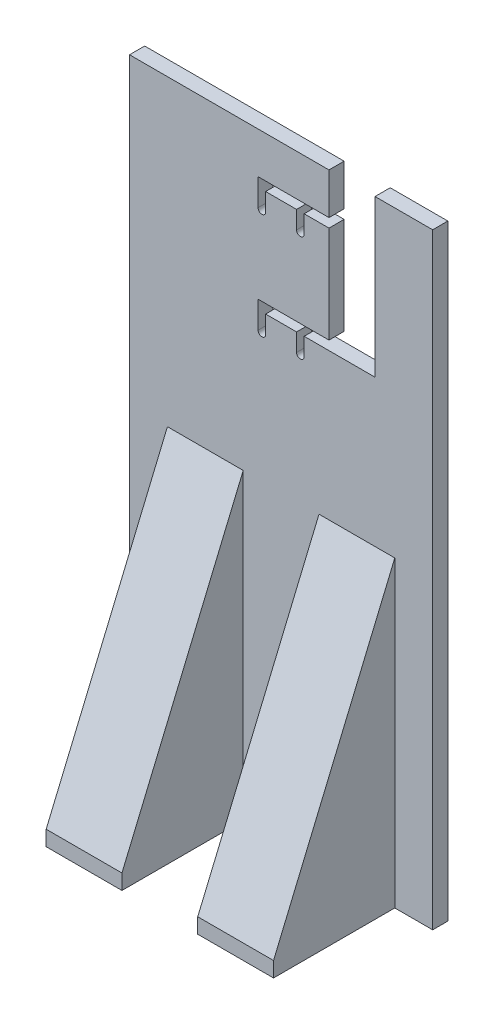
ISO-10303-21;
HEADER;
FILE_DESCRIPTION(('STEP AP214'),'2;1');
FILE_NAME('part.step','',(''),(''),'','','');
FILE_SCHEMA(('AUTOMOTIVE_DESIGN { 1 0 10303 214 1 1 1 1 }'));
ENDSEC;
DATA;
#1=APPLICATION_CONTEXT('core data for automotive mechanical design processes');
#2=APPLICATION_PROTOCOL_DEFINITION('international standard','automotive_design',2000,#1);
#3=PRODUCT_CONTEXT('',#1,'mechanical');
#4=PRODUCT('Part','Part','',(#3));
#5=PRODUCT_RELATED_PRODUCT_CATEGORY('part','',(#4));
#6=PRODUCT_DEFINITION_FORMATION('','',#4);
#7=PRODUCT_DEFINITION_CONTEXT('part definition',#1,'design');
#8=PRODUCT_DEFINITION('design','',#6,#7);
#9=PRODUCT_DEFINITION_SHAPE('','',#8);
#10=(LENGTH_UNIT() NAMED_UNIT(*) SI_UNIT(.MILLI.,.METRE.));
#11=(NAMED_UNIT(*) PLANE_ANGLE_UNIT() SI_UNIT($,.RADIAN.));
#12=(NAMED_UNIT(*) SI_UNIT($,.STERADIAN.) SOLID_ANGLE_UNIT());
#13=UNCERTAINTY_MEASURE_WITH_UNIT(LENGTH_MEASURE(1.E-05),#10,'distance_accuracy_value','');
#14=(GEOMETRIC_REPRESENTATION_CONTEXT(3) GLOBAL_UNCERTAINTY_ASSIGNED_CONTEXT((#13)) GLOBAL_UNIT_ASSIGNED_CONTEXT((#10,
#11,#12)) REPRESENTATION_CONTEXT('',''));
#15=CARTESIAN_POINT('',(0.,0.,0.));
#16=DIRECTION('',(0.,0.,1.));
#17=DIRECTION('',(1.,0.,0.));
#18=AXIS2_PLACEMENT_3D('',#15,#16,#17);
#19=CARTESIAN_POINT('',(15.,1.,14.));
#20=DIRECTION('',(0.,0.388057000058133,0.921635375138065));
#21=DIRECTION('',(0.,0.921635375138065,-0.388057000058133));
#22=AXIS2_PLACEMENT_3D('',#19,#20,#21);
#23=PLANE('',#22);
#24=DIRECTION('',(1.,0.,0.));
#25=VECTOR('',#24,1.);
#26=CARTESIAN_POINT('',(0.,20.,6.));
#27=LINE('',#26,#25);
#28=CARTESIAN_POINT('',(12.5,20.,6.));
#29=VERTEX_POINT('',#28);
#30=CARTESIAN_POINT('',(17.5,20.,6.));
#31=VERTEX_POINT('',#30);
#32=EDGE_CURVE('E302',#29,#31,#27,.T.);
#33=ORIENTED_EDGE('',*,*,#32,.F.);
#34=DIRECTION('',(0.,0.921635375138065,-0.388057000058133));
#35=VECTOR('',#34,1.);
#36=CARTESIAN_POINT('',(12.5,1.,14.));
#37=LINE('',#36,#35);
#38=CARTESIAN_POINT('',(12.5,1.,14.));
#39=VERTEX_POINT('',#38);
#40=EDGE_CURVE('E298',#39,#29,#37,.T.);
#41=ORIENTED_EDGE('',*,*,#40,.F.);
#42=DIRECTION('',(-1.,0.,0.));
#43=VECTOR('',#42,1.);
#44=CARTESIAN_POINT('',(17.5,1.,14.));
#45=LINE('',#44,#43);
#46=CARTESIAN_POINT('',(17.5,1.,14.));
#47=VERTEX_POINT('',#46);
#48=EDGE_CURVE('E310',#47,#39,#45,.T.);
#49=ORIENTED_EDGE('',*,*,#48,.F.);
#50=DIRECTION('',(0.,0.921635375138065,-0.388057000058133));
#51=VECTOR('',#50,1.);
#52=CARTESIAN_POINT('',(17.5,1.,14.));
#53=LINE('',#52,#51);
#54=EDGE_CURVE('E293',#47,#31,#53,.T.);
#55=ORIENTED_EDGE('',*,*,#54,.T.);
#56=EDGE_LOOP('',(#33,#41,#49,#55));
#57=FACE_BOUND('',#56,.T.);
#58=ADVANCED_FACE('F45',(#57),#23,.T.);
#59=CARTESIAN_POINT('',(5.,1.,14.));
#60=DIRECTION('',(0.,-0.388057000058133,-0.921635375138065));
#61=DIRECTION('',(0.,0.921635375138065,-0.388057000058133));
#62=AXIS2_PLACEMENT_3D('',#59,#60,#61);
#63=PLANE('',#62);
#64=DIRECTION('',(-1.,0.,0.));
#65=VECTOR('',#64,1.);
#66=CARTESIAN_POINT('',(0.,20.,6.));
#67=LINE('',#66,#65);
#68=CARTESIAN_POINT('',(2.5,20.,6.));
#69=VERTEX_POINT('',#68);
#70=CARTESIAN_POINT('',(7.5,20.,6.));
#71=VERTEX_POINT('',#70);
#72=EDGE_CURVE('E344',#69,#71,#67,.F.);
#73=ORIENTED_EDGE('',*,*,#72,.F.);
#74=DIRECTION('',(0.,0.921635375138065,-0.388057000058133));
#75=VECTOR('',#74,1.);
#76=CARTESIAN_POINT('',(2.5,1.,14.));
#77=LINE('',#76,#75);
#78=CARTESIAN_POINT('',(2.5,1.,14.));
#79=VERTEX_POINT('',#78);
#80=EDGE_CURVE('E330',#79,#69,#77,.T.);
#81=ORIENTED_EDGE('',*,*,#80,.F.);
#82=DIRECTION('',(1.,0.,0.));
#83=VECTOR('',#82,1.);
#84=CARTESIAN_POINT('',(2.5,1.,14.));
#85=LINE('',#84,#83);
#86=CARTESIAN_POINT('',(7.5,1.,14.));
#87=VERTEX_POINT('',#86);
#88=EDGE_CURVE('E352',#79,#87,#85,.T.);
#89=ORIENTED_EDGE('',*,*,#88,.T.);
#90=DIRECTION('',(0.,0.921635375138065,-0.388057000058133));
#91=VECTOR('',#90,1.);
#92=CARTESIAN_POINT('',(7.5,1.,14.));
#93=LINE('',#92,#91);
#94=EDGE_CURVE('E340',#87,#71,#93,.T.);
#95=ORIENTED_EDGE('',*,*,#94,.T.);
#96=EDGE_LOOP('',(#73,#81,#89,#95));
#97=FACE_BOUND('',#96,.T.);
#98=ADVANCED_FACE('F475',(#97),#63,.F.);
#99=CARTESIAN_POINT('',(2.5,1.,6.));
#100=DIRECTION('',(1.,0.,0.));
#101=DIRECTION('',(0.,0.,-1.));
#102=AXIS2_PLACEMENT_3D('',#99,#100,#101);
#103=PLANE('',#102);
#104=DIRECTION('',(0.,0.,1.));
#105=VECTOR('',#104,1.);
#106=CARTESIAN_POINT('',(2.5,0.,6.));
#107=LINE('',#106,#105);
#108=CARTESIAN_POINT('',(2.5,0.,6.));
#109=VERTEX_POINT('',#108);
#110=CARTESIAN_POINT('',(2.5,0.,14.));
#111=VERTEX_POINT('',#110);
#112=EDGE_CURVE('E351',#109,#111,#107,.T.);
#113=ORIENTED_EDGE('',*,*,#112,.T.);
#114=DIRECTION('',(0.,-1.,0.));
#115=VECTOR('',#114,1.);
#116=CARTESIAN_POINT('',(2.5,1.,14.));
#117=LINE('',#116,#115);
#118=EDGE_CURVE('E366',#79,#111,#117,.T.);
#119=ORIENTED_EDGE('',*,*,#118,.F.);
#120=ORIENTED_EDGE('',*,*,#80,.T.);
#121=DIRECTION('',(0.,-1.,0.));
#122=VECTOR('',#121,1.);
#123=CARTESIAN_POINT('',(2.5,1.,6.));
#124=LINE('',#123,#122);
#125=EDGE_CURVE('E356',#69,#109,#124,.T.);
#126=ORIENTED_EDGE('',*,*,#125,.T.);
#127=EDGE_LOOP('',(#113,#119,#120,#126));
#128=FACE_BOUND('',#127,.T.);
#129=ADVANCED_FACE('F471',(#128),#103,.F.);
#130=CARTESIAN_POINT('',(2.5,1.,14.));
#131=DIRECTION('',(0.,0.,-1.));
#132=DIRECTION('',(-1.,0.,0.));
#133=AXIS2_PLACEMENT_3D('',#130,#131,#132);
#134=PLANE('',#133);
#135=DIRECTION('',(1.,0.,0.));
#136=VECTOR('',#135,1.);
#137=CARTESIAN_POINT('',(2.5,0.,14.));
#138=LINE('',#137,#136);
#139=CARTESIAN_POINT('',(7.5,0.,14.));
#140=VERTEX_POINT('',#139);
#141=EDGE_CURVE('E357',#111,#140,#138,.T.);
#142=ORIENTED_EDGE('',*,*,#141,.T.);
#143=DIRECTION('',(0.,-1.,0.));
#144=VECTOR('',#143,1.);
#145=CARTESIAN_POINT('',(7.5,1.,14.));
#146=LINE('',#145,#144);
#147=EDGE_CURVE('E371',#87,#140,#146,.T.);
#148=ORIENTED_EDGE('',*,*,#147,.F.);
#149=ORIENTED_EDGE('',*,*,#88,.F.);
#150=ORIENTED_EDGE('',*,*,#118,.T.);
#151=EDGE_LOOP('',(#142,#148,#149,#150));
#152=FACE_BOUND('',#151,.T.);
#153=ADVANCED_FACE('F474',(#152),#134,.F.);
#154=CARTESIAN_POINT('',(7.5,1.,6.));
#155=DIRECTION('',(-1.,0.,0.));
#156=DIRECTION('',(0.,0.,1.));
#157=AXIS2_PLACEMENT_3D('',#154,#155,#156);
#158=PLANE('',#157);
#159=DIRECTION('',(0.,-1.,0.));
#160=VECTOR('',#159,1.);
#161=CARTESIAN_POINT('',(7.5,1.,6.));
#162=LINE('',#161,#160);
#163=CARTESIAN_POINT('',(7.5,0.,6.));
#164=VERTEX_POINT('',#163);
#165=EDGE_CURVE('E375',#71,#164,#162,.T.);
#166=ORIENTED_EDGE('',*,*,#165,.F.);
#167=ORIENTED_EDGE('',*,*,#94,.F.);
#168=ORIENTED_EDGE('',*,*,#147,.T.);
#169=DIRECTION('',(0.,0.,-1.));
#170=VECTOR('',#169,1.);
#171=CARTESIAN_POINT('',(7.5,0.,6.));
#172=LINE('',#171,#170);
#173=EDGE_CURVE('E361',#140,#164,#172,.T.);
#174=ORIENTED_EDGE('',*,*,#173,.T.);
#175=EDGE_LOOP('',(#166,#167,#168,#174));
#176=FACE_BOUND('',#175,.T.);
#177=ADVANCED_FACE('F477',(#176),#158,.F.);
#178=CARTESIAN_POINT('',(12.5,1.,6.));
#179=DIRECTION('',(-1.,0.,0.));
#180=DIRECTION('',(0.,0.,1.));
#181=AXIS2_PLACEMENT_3D('',#178,#179,#180);
#182=PLANE('',#181);
#183=ORIENTED_EDGE('',*,*,#40,.T.);
#184=DIRECTION('',(0.,-1.,0.));
#185=VECTOR('',#184,1.);
#186=CARTESIAN_POINT('',(12.5,1.,6.));
#187=LINE('',#186,#185);
#188=CARTESIAN_POINT('',(12.5,0.,6.));
#189=VERTEX_POINT('',#188);
#190=EDGE_CURVE('E331',#29,#189,#187,.T.);
#191=ORIENTED_EDGE('',*,*,#190,.T.);
#192=DIRECTION('',(0.,0.,-1.));
#193=VECTOR('',#192,1.);
#194=CARTESIAN_POINT('',(12.5,0.,6.));
#195=LINE('',#194,#193);
#196=CARTESIAN_POINT('',(12.5,0.,14.));
#197=VERTEX_POINT('',#196);
#198=EDGE_CURVE('E315',#197,#189,#195,.T.);
#199=ORIENTED_EDGE('',*,*,#198,.F.);
#200=DIRECTION('',(0.,-1.,0.));
#201=VECTOR('',#200,1.);
#202=CARTESIAN_POINT('',(12.5,1.,14.));
#203=LINE('',#202,#201);
#204=EDGE_CURVE('E335',#39,#197,#203,.T.);
#205=ORIENTED_EDGE('',*,*,#204,.F.);
#206=EDGE_LOOP('',(#183,#191,#199,#205));
#207=FACE_BOUND('',#206,.T.);
#208=ADVANCED_FACE('F437',(#207),#182,.T.);
#209=CARTESIAN_POINT('',(17.5,1.,14.));
#210=DIRECTION('',(0.,0.,1.));
#211=DIRECTION('',(1.,0.,0.));
#212=AXIS2_PLACEMENT_3D('',#209,#210,#211);
#213=PLANE('',#212);
#214=DIRECTION('',(-1.,0.,0.));
#215=VECTOR('',#214,1.);
#216=CARTESIAN_POINT('',(17.5,0.,14.));
#217=LINE('',#216,#215);
#218=CARTESIAN_POINT('',(17.5,0.,14.));
#219=VERTEX_POINT('',#218);
#220=EDGE_CURVE('E319',#219,#197,#217,.T.);
#221=ORIENTED_EDGE('',*,*,#220,.F.);
#222=DIRECTION('',(0.,-1.,0.));
#223=VECTOR('',#222,1.);
#224=CARTESIAN_POINT('',(17.5,1.,14.));
#225=LINE('',#224,#223);
#226=EDGE_CURVE('E314',#47,#219,#225,.T.);
#227=ORIENTED_EDGE('',*,*,#226,.F.);
#228=ORIENTED_EDGE('',*,*,#48,.T.);
#229=ORIENTED_EDGE('',*,*,#204,.T.);
#230=EDGE_LOOP('',(#221,#227,#228,#229));
#231=FACE_BOUND('',#230,.T.);
#232=ADVANCED_FACE('F442',(#231),#213,.T.);
#233=CARTESIAN_POINT('',(17.5,1.,6.));
#234=DIRECTION('',(1.,0.,0.));
#235=DIRECTION('',(0.,0.,-1.));
#236=AXIS2_PLACEMENT_3D('',#233,#234,#235);
#237=PLANE('',#236);
#238=DIRECTION('',(0.,0.,1.));
#239=VECTOR('',#238,1.);
#240=CARTESIAN_POINT('',(17.5,0.,6.));
#241=LINE('',#240,#239);
#242=CARTESIAN_POINT('',(17.5,0.,6.));
#243=VERTEX_POINT('',#242);
#244=EDGE_CURVE('E309',#243,#219,#241,.T.);
#245=ORIENTED_EDGE('',*,*,#244,.F.);
#246=DIRECTION('',(0.,-1.,0.));
#247=VECTOR('',#246,1.);
#248=CARTESIAN_POINT('',(17.5,1.,6.));
#249=LINE('',#248,#247);
#250=EDGE_CURVE('E326',#31,#243,#249,.T.);
#251=ORIENTED_EDGE('',*,*,#250,.F.);
#252=ORIENTED_EDGE('',*,*,#54,.F.);
#253=ORIENTED_EDGE('',*,*,#226,.T.);
#254=EDGE_LOOP('',(#245,#251,#252,#253));
#255=FACE_BOUND('',#254,.T.);
#256=ADVANCED_FACE('F446',(#255),#237,.T.);
#257=CARTESIAN_POINT('',(0.,0.,6.));
#258=DIRECTION('',(1.,0.,0.));
#259=DIRECTION('',(0.,0.,-1.));
#260=AXIS2_PLACEMENT_3D('',#257,#258,#259);
#261=PLANE('',#260);
#262=DIRECTION('',(0.,0.,-1.));
#263=VECTOR('',#262,1.);
#264=CARTESIAN_POINT('',(0.,40.,6.));
#265=LINE('',#264,#263);
#266=CARTESIAN_POINT('',(0.,40.,6.));
#267=VERTEX_POINT('',#266);
#268=CARTESIAN_POINT('',(0.,40.,5.));
#269=VERTEX_POINT('',#268);
#270=EDGE_CURVE('E397',#267,#269,#265,.T.);
#271=ORIENTED_EDGE('',*,*,#270,.T.);
#272=DIRECTION('',(0.,-1.,0.));
#273=VECTOR('',#272,1.);
#274=CARTESIAN_POINT('',(0.,0.,5.));
#275=LINE('',#274,#273);
#276=CARTESIAN_POINT('',(0.,0.,5.));
#277=VERTEX_POINT('',#276);
#278=EDGE_CURVE('E11',#269,#277,#275,.T.);
#279=ORIENTED_EDGE('',*,*,#278,.T.);
#280=DIRECTION('',(0.,0.,-1.));
#281=VECTOR('',#280,1.);
#282=CARTESIAN_POINT('',(0.,0.,6.));
#283=LINE('',#282,#281);
#284=CARTESIAN_POINT('',(0.,0.,6.));
#285=VERTEX_POINT('',#284);
#286=EDGE_CURVE('E408',#285,#277,#283,.T.);
#287=ORIENTED_EDGE('',*,*,#286,.F.);
#288=DIRECTION('',(0.,-1.,0.));
#289=VECTOR('',#288,1.);
#290=CARTESIAN_POINT('',(0.,0.,6.));
#291=LINE('',#290,#289);
#292=EDGE_CURVE('E370',#267,#285,#291,.T.);
#293=ORIENTED_EDGE('',*,*,#292,.F.);
#294=EDGE_LOOP('',(#271,#279,#287,#293));
#295=FACE_BOUND('',#294,.T.);
#296=ADVANCED_FACE('F47',(#295),#261,.F.);
#297=CARTESIAN_POINT('',(0.,40.,6.));
#298=DIRECTION('',(0.,-1.,0.));
#299=DIRECTION('',(0.,0.,-1.));
#300=AXIS2_PLACEMENT_3D('',#297,#298,#299);
#301=PLANE('',#300);
#302=DIRECTION('',(-1.,0.,0.));
#303=VECTOR('',#302,1.);
#304=CARTESIAN_POINT('',(12.8029216991025,40.,5.));
#305=LINE('',#304,#303);
#306=CARTESIAN_POINT('',(13.1579216991025,40.,5.));
#307=VERTEX_POINT('',#306);
#308=EDGE_CURVE('E61',#307,#269,#305,.T.);
#309=ORIENTED_EDGE('',*,*,#308,.T.);
#310=ORIENTED_EDGE('',*,*,#270,.F.);
#311=DIRECTION('',(-1.,0.,0.));
#312=VECTOR('',#311,1.);
#313=CARTESIAN_POINT('',(0.,40.,6.));
#314=LINE('',#313,#312);
#315=CARTESIAN_POINT('',(13.1579216991025,40.,6.));
#316=VERTEX_POINT('',#315);
#317=EDGE_CURVE('E281',#316,#267,#314,.T.);
#318=ORIENTED_EDGE('',*,*,#317,.F.);
#319=DIRECTION('',(0.,0.,-1.));
#320=VECTOR('',#319,1.);
#321=CARTESIAN_POINT('',(13.1579216991025,40.,14.));
#322=LINE('',#321,#320);
#323=EDGE_CURVE('E269',#316,#307,#322,.T.);
#324=ORIENTED_EDGE('',*,*,#323,.T.);
#325=EDGE_LOOP('',(#309,#310,#318,#324));
#326=FACE_BOUND('',#325,.T.);
#327=ADVANCED_FACE('F280',(#326),#301,.F.);
#328=CARTESIAN_POINT('',(13.1579216991025,40.,14.));
#329=DIRECTION('',(1.,0.,0.));
#330=DIRECTION('',(0.,0.,-1.));
#331=AXIS2_PLACEMENT_3D('',#328,#329,#330);
#332=PLANE('',#331);
#333=DIRECTION('',(0.,-1.,0.));
#334=VECTOR('',#333,1.);
#335=CARTESIAN_POINT('',(13.1579216991025,0.,6.));
#336=LINE('',#335,#334);
#337=CARTESIAN_POINT('',(13.1579216991025,37.275,6.));
#338=VERTEX_POINT('',#337);
#339=EDGE_CURVE('E288',#316,#338,#336,.T.);
#340=ORIENTED_EDGE('',*,*,#339,.T.);
#341=DIRECTION('',(0.,0.,-1.));
#342=VECTOR('',#341,1.);
#343=CARTESIAN_POINT('',(13.1579216991025,37.275,14.));
#344=LINE('',#343,#342);
#345=CARTESIAN_POINT('',(13.1579216991025,37.275,5.));
#346=VERTEX_POINT('',#345);
#347=EDGE_CURVE('E272',#338,#346,#344,.T.);
#348=ORIENTED_EDGE('',*,*,#347,.T.);
#349=DIRECTION('',(0.,-1.,0.));
#350=VECTOR('',#349,1.);
#351=CARTESIAN_POINT('',(13.1579216991025,40.,5.));
#352=LINE('',#351,#350);
#353=EDGE_CURVE('E267',#307,#346,#352,.T.);
#354=ORIENTED_EDGE('',*,*,#353,.F.);
#355=ORIENTED_EDGE('',*,*,#323,.F.);
#356=EDGE_LOOP('',(#340,#348,#354,#355));
#357=FACE_BOUND('',#356,.T.);
#358=ADVANCED_FACE('F268',(#357),#332,.T.);
#359=CARTESIAN_POINT('',(13.1579216991025,37.275,14.));
#360=DIRECTION('',(0.,-1.,0.));
#361=DIRECTION('',(0.,0.,-1.));
#362=AXIS2_PLACEMENT_3D('',#359,#360,#361);
#363=PLANE('',#362);
#364=DIRECTION('',(-1.,0.,0.));
#365=VECTOR('',#364,1.);
#366=CARTESIAN_POINT('',(0.,37.275,6.));
#367=LINE('',#366,#365);
#368=CARTESIAN_POINT('',(8.48,37.275,6.));
#369=VERTEX_POINT('',#368);
#370=EDGE_CURVE('E294',#338,#369,#367,.T.);
#371=ORIENTED_EDGE('',*,*,#370,.T.);
#372=DIRECTION('',(0.,0.,-1.));
#373=VECTOR('',#372,1.);
#374=CARTESIAN_POINT('',(8.48,37.275,14.));
#375=LINE('',#374,#373);
#376=CARTESIAN_POINT('',(8.48,37.275,5.));
#377=VERTEX_POINT('',#376);
#378=EDGE_CURVE('E504',#369,#377,#375,.T.);
#379=ORIENTED_EDGE('',*,*,#378,.T.);
#380=DIRECTION('',(-1.,0.,0.));
#381=VECTOR('',#380,1.);
#382=CARTESIAN_POINT('',(13.1579216991025,37.275,5.));
#383=LINE('',#382,#381);
#384=EDGE_CURVE('E277',#346,#377,#383,.T.);
#385=ORIENTED_EDGE('',*,*,#384,.F.);
#386=ORIENTED_EDGE('',*,*,#347,.F.);
#387=EDGE_LOOP('',(#371,#379,#385,#386));
#388=FACE_BOUND('',#387,.T.);
#389=ADVANCED_FACE('F501',(#388),#363,.T.);
#390=CARTESIAN_POINT('',(8.48,37.275,14.));
#391=DIRECTION('',(1.,0.,0.));
#392=DIRECTION('',(0.,0.,-1.));
#393=AXIS2_PLACEMENT_3D('',#390,#391,#392);
#394=PLANE('',#393);
#395=DIRECTION('',(0.,-1.,0.));
#396=VECTOR('',#395,1.);
#397=CARTESIAN_POINT('',(8.48,0.,6.));
#398=LINE('',#397,#396);
#399=CARTESIAN_POINT('',(8.48,35.5,6.));
#400=VERTEX_POINT('',#399);
#401=EDGE_CURVE('E564',#369,#400,#398,.T.);
#402=ORIENTED_EDGE('',*,*,#401,.T.);
#403=DIRECTION('',(0.,0.,-1.));
#404=VECTOR('',#403,1.);
#405=CARTESIAN_POINT('',(8.48,35.5,14.));
#406=LINE('',#405,#404);
#407=CARTESIAN_POINT('',(8.48,35.5,5.));
#408=VERTEX_POINT('',#407);
#409=EDGE_CURVE('E507',#400,#408,#406,.T.);
#410=ORIENTED_EDGE('',*,*,#409,.T.);
#411=DIRECTION('',(0.,-1.,0.));
#412=VECTOR('',#411,1.);
#413=CARTESIAN_POINT('',(8.48,37.275,5.));
#414=LINE('',#413,#412);
#415=EDGE_CURVE('E715',#377,#408,#414,.T.);
#416=ORIENTED_EDGE('',*,*,#415,.F.);
#417=ORIENTED_EDGE('',*,*,#378,.F.);
#418=EDGE_LOOP('',(#402,#410,#416,#417));
#419=FACE_BOUND('',#418,.T.);
#420=ADVANCED_FACE('F569',(#419),#394,.T.);
#421=CARTESIAN_POINT('',(8.73,35.5,14.));
#422=DIRECTION('',(0.,0.,-1.));
#423=DIRECTION('',(-1.,0.,0.));
#424=AXIS2_PLACEMENT_3D('',#421,#422,#423);
#425=CYLINDRICAL_SURFACE('',#424,0.25);
#426=CARTESIAN_POINT('',(8.73,35.5,6.));
#427=DIRECTION('',(0.,0.,-1.));
#428=DIRECTION('',(-1.,0.,0.));
#429=AXIS2_PLACEMENT_3D('',#426,#427,#428);
#430=CIRCLE('',#429,0.25);
#431=CARTESIAN_POINT('',(8.98,35.5,6.));
#432=VERTEX_POINT('',#431);
#433=EDGE_CURVE('E561',#400,#432,#430,.F.);
#434=ORIENTED_EDGE('',*,*,#433,.T.);
#435=DIRECTION('',(0.,0.,-1.));
#436=VECTOR('',#435,1.);
#437=CARTESIAN_POINT('',(8.98,35.5,14.));
#438=LINE('',#437,#436);
#439=CARTESIAN_POINT('',(8.98,35.5,5.));
#440=VERTEX_POINT('',#439);
#441=EDGE_CURVE('E580',#432,#440,#438,.T.);
#442=ORIENTED_EDGE('',*,*,#441,.T.);
#443=CARTESIAN_POINT('',(8.73,35.5,5.));
#444=DIRECTION('',(0.,0.,1.));
#445=DIRECTION('',(1.,0.,0.));
#446=AXIS2_PLACEMENT_3D('',#443,#444,#445);
#447=CIRCLE('',#446,0.25);
#448=EDGE_CURVE('E577',#408,#440,#447,.T.);
#449=ORIENTED_EDGE('',*,*,#448,.F.);
#450=ORIENTED_EDGE('',*,*,#409,.F.);
#451=EDGE_LOOP('',(#434,#442,#449,#450));
#452=FACE_BOUND('',#451,.T.);
#453=ADVANCED_FACE('F574',(#452),#425,.F.);
#454=CARTESIAN_POINT('',(8.98,35.5,14.));
#455=DIRECTION('',(-1.,0.,0.));
#456=DIRECTION('',(0.,0.,1.));
#457=AXIS2_PLACEMENT_3D('',#454,#455,#456);
#458=PLANE('',#457);
#459=DIRECTION('',(0.,1.,0.));
#460=VECTOR('',#459,1.);
#461=CARTESIAN_POINT('',(8.98,0.,6.));
#462=LINE('',#461,#460);
#463=CARTESIAN_POINT('',(8.98,36.675,6.));
#464=VERTEX_POINT('',#463);
#465=EDGE_CURVE('E558',#432,#464,#462,.T.);
#466=ORIENTED_EDGE('',*,*,#465,.T.);
#467=DIRECTION('',(0.,0.,-1.));
#468=VECTOR('',#467,1.);
#469=CARTESIAN_POINT('',(8.98,36.675,14.));
#470=LINE('',#469,#468);
#471=CARTESIAN_POINT('',(8.98,36.675,5.));
#472=VERTEX_POINT('',#471);
#473=EDGE_CURVE('E588',#464,#472,#470,.T.);
#474=ORIENTED_EDGE('',*,*,#473,.T.);
#475=DIRECTION('',(0.,1.,0.));
#476=VECTOR('',#475,1.);
#477=CARTESIAN_POINT('',(8.98,35.5,5.));
#478=LINE('',#477,#476);
#479=EDGE_CURVE('E710',#440,#472,#478,.T.);
#480=ORIENTED_EDGE('',*,*,#479,.F.);
#481=ORIENTED_EDGE('',*,*,#441,.F.);
#482=EDGE_LOOP('',(#466,#474,#480,#481));
#483=FACE_BOUND('',#482,.T.);
#484=ADVANCED_FACE('F586',(#483),#458,.T.);
#485=CARTESIAN_POINT('',(8.98,36.675,14.));
#486=DIRECTION('',(0.,1.,0.));
#487=DIRECTION('',(0.,0.,1.));
#488=AXIS2_PLACEMENT_3D('',#485,#486,#487);
#489=PLANE('',#488);
#490=DIRECTION('',(1.,0.,0.));
#491=VECTOR('',#490,1.);
#492=CARTESIAN_POINT('',(0.,36.675,6.));
#493=LINE('',#492,#491);
#494=CARTESIAN_POINT('',(11.02,36.675,6.));
#495=VERTEX_POINT('',#494);
#496=EDGE_CURVE('E555',#464,#495,#493,.T.);
#497=ORIENTED_EDGE('',*,*,#496,.T.);
#498=DIRECTION('',(0.,0.,-1.));
#499=VECTOR('',#498,1.);
#500=CARTESIAN_POINT('',(11.02,36.675,14.));
#501=LINE('',#500,#499);
#502=CARTESIAN_POINT('',(11.02,36.675,5.));
#503=VERTEX_POINT('',#502);
#504=EDGE_CURVE('E597',#495,#503,#501,.T.);
#505=ORIENTED_EDGE('',*,*,#504,.T.);
#506=DIRECTION('',(1.,0.,0.));
#507=VECTOR('',#506,1.);
#508=CARTESIAN_POINT('',(8.98,36.675,5.));
#509=LINE('',#508,#507);
#510=EDGE_CURVE('E594',#472,#503,#509,.T.);
#511=ORIENTED_EDGE('',*,*,#510,.F.);
#512=ORIENTED_EDGE('',*,*,#473,.F.);
#513=EDGE_LOOP('',(#497,#505,#511,#512));
#514=FACE_BOUND('',#513,.T.);
#515=ADVANCED_FACE('F591',(#514),#489,.T.);
#516=CARTESIAN_POINT('',(11.02,36.675,14.));
#517=DIRECTION('',(1.,0.,0.));
#518=DIRECTION('',(0.,0.,-1.));
#519=AXIS2_PLACEMENT_3D('',#516,#517,#518);
#520=PLANE('',#519);
#521=DIRECTION('',(0.,-1.,0.));
#522=VECTOR('',#521,1.);
#523=CARTESIAN_POINT('',(11.02,0.,6.));
#524=LINE('',#523,#522);
#525=CARTESIAN_POINT('',(11.02,35.5,6.));
#526=VERTEX_POINT('',#525);
#527=EDGE_CURVE('E552',#495,#526,#524,.T.);
#528=ORIENTED_EDGE('',*,*,#527,.T.);
#529=DIRECTION('',(0.,0.,-1.));
#530=VECTOR('',#529,1.);
#531=CARTESIAN_POINT('',(11.02,35.5,14.));
#532=LINE('',#531,#530);
#533=CARTESIAN_POINT('',(11.02,35.5,5.));
#534=VERTEX_POINT('',#533);
#535=EDGE_CURVE('E602',#526,#534,#532,.T.);
#536=ORIENTED_EDGE('',*,*,#535,.T.);
#537=DIRECTION('',(0.,-1.,0.));
#538=VECTOR('',#537,1.);
#539=CARTESIAN_POINT('',(11.02,36.675,5.));
#540=LINE('',#539,#538);
#541=EDGE_CURVE('E704',#503,#534,#540,.T.);
#542=ORIENTED_EDGE('',*,*,#541,.F.);
#543=ORIENTED_EDGE('',*,*,#504,.F.);
#544=EDGE_LOOP('',(#528,#536,#542,#543));
#545=FACE_BOUND('',#544,.T.);
#546=ADVANCED_FACE('F722',(#545),#520,.T.);
#547=CARTESIAN_POINT('',(11.27,35.5,14.));
#548=DIRECTION('',(0.,0.,-1.));
#549=DIRECTION('',(-1.,0.,0.));
#550=AXIS2_PLACEMENT_3D('',#547,#548,#549);
#551=CYLINDRICAL_SURFACE('',#550,0.25);
#552=CARTESIAN_POINT('',(11.27,35.5,6.));
#553=DIRECTION('',(0.,0.,-1.));
#554=DIRECTION('',(-1.,0.,0.));
#555=AXIS2_PLACEMENT_3D('',#552,#553,#554);
#556=CIRCLE('',#555,0.25);
#557=CARTESIAN_POINT('',(11.52,35.5,6.));
#558=VERTEX_POINT('',#557);
#559=EDGE_CURVE('E549',#526,#558,#556,.F.);
#560=ORIENTED_EDGE('',*,*,#559,.T.);
#561=DIRECTION('',(0.,0.,-1.));
#562=VECTOR('',#561,1.);
#563=CARTESIAN_POINT('',(11.52,35.5,14.));
#564=LINE('',#563,#562);
#565=CARTESIAN_POINT('',(11.52,35.5,5.));
#566=VERTEX_POINT('',#565);
#567=EDGE_CURVE('E607',#558,#566,#564,.T.);
#568=ORIENTED_EDGE('',*,*,#567,.T.);
#569=CARTESIAN_POINT('',(11.27,35.5,5.));
#570=DIRECTION('',(0.,0.,1.));
#571=DIRECTION('',(1.,0.,0.));
#572=AXIS2_PLACEMENT_3D('',#569,#570,#571);
#573=CIRCLE('',#572,0.25);
#574=EDGE_CURVE('E700',#534,#566,#573,.T.);
#575=ORIENTED_EDGE('',*,*,#574,.F.);
#576=ORIENTED_EDGE('',*,*,#535,.F.);
#577=EDGE_LOOP('',(#560,#568,#575,#576));
#578=FACE_BOUND('',#577,.T.);
#579=ADVANCED_FACE('F726',(#578),#551,.F.);
#580=CARTESIAN_POINT('',(11.52,35.5,14.));
#581=DIRECTION('',(-1.,0.,0.));
#582=DIRECTION('',(0.,0.,1.));
#583=AXIS2_PLACEMENT_3D('',#580,#581,#582);
#584=PLANE('',#583);
#585=DIRECTION('',(0.,1.,0.));
#586=VECTOR('',#585,1.);
#587=CARTESIAN_POINT('',(11.52,0.,6.));
#588=LINE('',#587,#586);
#589=CARTESIAN_POINT('',(11.52,36.675,6.));
#590=VERTEX_POINT('',#589);
#591=EDGE_CURVE('E546',#558,#590,#588,.T.);
#592=ORIENTED_EDGE('',*,*,#591,.T.);
#593=DIRECTION('',(0.,0.,-1.));
#594=VECTOR('',#593,1.);
#595=CARTESIAN_POINT('',(11.52,36.675,14.));
#596=LINE('',#595,#594);
#597=CARTESIAN_POINT('',(11.52,36.675,5.));
#598=VERTEX_POINT('',#597);
#599=EDGE_CURVE('E610',#590,#598,#596,.T.);
#600=ORIENTED_EDGE('',*,*,#599,.T.);
#601=DIRECTION('',(0.,1.,0.));
#602=VECTOR('',#601,1.);
#603=CARTESIAN_POINT('',(11.52,35.5,5.));
#604=LINE('',#603,#602);
#605=EDGE_CURVE('E696',#566,#598,#604,.T.);
#606=ORIENTED_EDGE('',*,*,#605,.F.);
#607=ORIENTED_EDGE('',*,*,#567,.F.);
#608=EDGE_LOOP('',(#592,#600,#606,#607));
#609=FACE_BOUND('',#608,.T.);
#610=ADVANCED_FACE('F731',(#609),#584,.T.);
#611=CARTESIAN_POINT('',(11.52,36.675,14.));
#612=DIRECTION('',(0.,1.,0.));
#613=DIRECTION('',(0.,0.,1.));
#614=AXIS2_PLACEMENT_3D('',#611,#612,#613);
#615=PLANE('',#614);
#616=DIRECTION('',(1.,0.,0.));
#617=VECTOR('',#616,1.);
#618=CARTESIAN_POINT('',(0.,36.675,6.));
#619=LINE('',#618,#617);
#620=CARTESIAN_POINT('',(13.1579216991025,36.675,6.));
#621=VERTEX_POINT('',#620);
#622=EDGE_CURVE('E543',#590,#621,#619,.T.);
#623=ORIENTED_EDGE('',*,*,#622,.T.);
#624=DIRECTION('',(0.,0.,-1.));
#625=VECTOR('',#624,1.);
#626=CARTESIAN_POINT('',(13.1579216991025,36.675,14.));
#627=LINE('',#626,#625);
#628=CARTESIAN_POINT('',(13.1579216991025,36.675,5.));
#629=VERTEX_POINT('',#628);
#630=EDGE_CURVE('E613',#621,#629,#627,.T.);
#631=ORIENTED_EDGE('',*,*,#630,.T.);
#632=DIRECTION('',(1.,0.,0.));
#633=VECTOR('',#632,1.);
#634=CARTESIAN_POINT('',(11.52,36.675,5.));
#635=LINE('',#634,#633);
#636=EDGE_CURVE('E692',#598,#629,#635,.T.);
#637=ORIENTED_EDGE('',*,*,#636,.F.);
#638=ORIENTED_EDGE('',*,*,#599,.F.);
#639=EDGE_LOOP('',(#623,#631,#637,#638));
#640=FACE_BOUND('',#639,.T.);
#641=ADVANCED_FACE('F736',(#640),#615,.T.);
#642=CARTESIAN_POINT('',(13.1579216991025,36.675,14.));
#643=DIRECTION('',(1.,0.,0.));
#644=DIRECTION('',(0.,0.,-1.));
#645=AXIS2_PLACEMENT_3D('',#642,#643,#644);
#646=PLANE('',#645);
#647=DIRECTION('',(0.,-1.,0.));
#648=VECTOR('',#647,1.);
#649=CARTESIAN_POINT('',(13.1579216991025,0.,6.));
#650=LINE('',#649,#648);
#651=CARTESIAN_POINT('',(13.1579216991025,30.275,6.));
#652=VERTEX_POINT('',#651);
#653=EDGE_CURVE('E540',#621,#652,#650,.T.);
#654=ORIENTED_EDGE('',*,*,#653,.T.);
#655=DIRECTION('',(0.,0.,-1.));
#656=VECTOR('',#655,1.);
#657=CARTESIAN_POINT('',(13.1579216991025,30.275,14.));
#658=LINE('',#657,#656);
#659=CARTESIAN_POINT('',(13.1579216991025,30.275,5.));
#660=VERTEX_POINT('',#659);
#661=EDGE_CURVE('E616',#652,#660,#658,.T.);
#662=ORIENTED_EDGE('',*,*,#661,.T.);
#663=DIRECTION('',(0.,-1.,0.));
#664=VECTOR('',#663,1.);
#665=CARTESIAN_POINT('',(13.1579216991025,36.675,5.));
#666=LINE('',#665,#664);
#667=EDGE_CURVE('E688',#629,#660,#666,.T.);
#668=ORIENTED_EDGE('',*,*,#667,.F.);
#669=ORIENTED_EDGE('',*,*,#630,.F.);
#670=EDGE_LOOP('',(#654,#662,#668,#669));
#671=FACE_BOUND('',#670,.T.);
#672=ADVANCED_FACE('F741',(#671),#646,.T.);
#673=CARTESIAN_POINT('',(13.1579216991025,30.275,14.));
#674=DIRECTION('',(0.,-1.,0.));
#675=DIRECTION('',(0.,0.,-1.));
#676=AXIS2_PLACEMENT_3D('',#673,#674,#675);
#677=PLANE('',#676);
#678=DIRECTION('',(-1.,0.,0.));
#679=VECTOR('',#678,1.);
#680=CARTESIAN_POINT('',(0.,30.275,6.));
#681=LINE('',#680,#679);
#682=CARTESIAN_POINT('',(8.48,30.275,6.));
#683=VERTEX_POINT('',#682);
#684=EDGE_CURVE('E537',#652,#683,#681,.T.);
#685=ORIENTED_EDGE('',*,*,#684,.T.);
#686=DIRECTION('',(0.,0.,-1.));
#687=VECTOR('',#686,1.);
#688=CARTESIAN_POINT('',(8.48,30.275,14.));
#689=LINE('',#688,#687);
#690=CARTESIAN_POINT('',(8.48,30.275,5.));
#691=VERTEX_POINT('',#690);
#692=EDGE_CURVE('E619',#683,#691,#689,.T.);
#693=ORIENTED_EDGE('',*,*,#692,.T.);
#694=DIRECTION('',(-1.,0.,0.));
#695=VECTOR('',#694,1.);
#696=CARTESIAN_POINT('',(13.1579216991025,30.275,5.));
#697=LINE('',#696,#695);
#698=EDGE_CURVE('E684',#660,#691,#697,.T.);
#699=ORIENTED_EDGE('',*,*,#698,.F.);
#700=ORIENTED_EDGE('',*,*,#661,.F.);
#701=EDGE_LOOP('',(#685,#693,#699,#700));
#702=FACE_BOUND('',#701,.T.);
#703=ADVANCED_FACE('F746',(#702),#677,.T.);
#704=CARTESIAN_POINT('',(8.48,30.275,14.));
#705=DIRECTION('',(1.,0.,0.));
#706=DIRECTION('',(0.,0.,-1.));
#707=AXIS2_PLACEMENT_3D('',#704,#705,#706);
#708=PLANE('',#707);
#709=DIRECTION('',(0.,-1.,0.));
#710=VECTOR('',#709,1.);
#711=CARTESIAN_POINT('',(8.48,0.,6.));
#712=LINE('',#711,#710);
#713=CARTESIAN_POINT('',(8.48,28.5,6.));
#714=VERTEX_POINT('',#713);
#715=EDGE_CURVE('E534',#683,#714,#712,.T.);
#716=ORIENTED_EDGE('',*,*,#715,.T.);
#717=DIRECTION('',(0.,0.,-1.));
#718=VECTOR('',#717,1.);
#719=CARTESIAN_POINT('',(8.48,28.5,14.));
#720=LINE('',#719,#718);
#721=CARTESIAN_POINT('',(8.48,28.5,5.));
#722=VERTEX_POINT('',#721);
#723=EDGE_CURVE('E622',#714,#722,#720,.T.);
#724=ORIENTED_EDGE('',*,*,#723,.T.);
#725=DIRECTION('',(0.,-1.,0.));
#726=VECTOR('',#725,1.);
#727=CARTESIAN_POINT('',(8.48,30.275,5.));
#728=LINE('',#727,#726);
#729=EDGE_CURVE('E680',#691,#722,#728,.T.);
#730=ORIENTED_EDGE('',*,*,#729,.F.);
#731=ORIENTED_EDGE('',*,*,#692,.F.);
#732=EDGE_LOOP('',(#716,#724,#730,#731));
#733=FACE_BOUND('',#732,.T.);
#734=ADVANCED_FACE('F751',(#733),#708,.T.);
#735=CARTESIAN_POINT('',(8.73,28.5,14.));
#736=DIRECTION('',(0.,0.,-1.));
#737=DIRECTION('',(-1.,0.,0.));
#738=AXIS2_PLACEMENT_3D('',#735,#736,#737);
#739=CYLINDRICAL_SURFACE('',#738,0.25);
#740=CARTESIAN_POINT('',(8.73,28.5,6.));
#741=DIRECTION('',(0.,0.,-1.));
#742=DIRECTION('',(-1.,0.,0.));
#743=AXIS2_PLACEMENT_3D('',#740,#741,#742);
#744=CIRCLE('',#743,0.25);
#745=CARTESIAN_POINT('',(8.98,28.5,6.));
#746=VERTEX_POINT('',#745);
#747=EDGE_CURVE('E531',#714,#746,#744,.F.);
#748=ORIENTED_EDGE('',*,*,#747,.T.);
#749=DIRECTION('',(0.,0.,-1.));
#750=VECTOR('',#749,1.);
#751=CARTESIAN_POINT('',(8.98,28.5,14.));
#752=LINE('',#751,#750);
#753=CARTESIAN_POINT('',(8.98,28.5,5.));
#754=VERTEX_POINT('',#753);
#755=EDGE_CURVE('E625',#746,#754,#752,.T.);
#756=ORIENTED_EDGE('',*,*,#755,.T.);
#757=CARTESIAN_POINT('',(8.73,28.5,5.));
#758=DIRECTION('',(0.,0.,1.));
#759=DIRECTION('',(1.,0.,0.));
#760=AXIS2_PLACEMENT_3D('',#757,#758,#759);
#761=CIRCLE('',#760,0.25);
#762=EDGE_CURVE('E676',#722,#754,#761,.T.);
#763=ORIENTED_EDGE('',*,*,#762,.F.);
#764=ORIENTED_EDGE('',*,*,#723,.F.);
#765=EDGE_LOOP('',(#748,#756,#763,#764));
#766=FACE_BOUND('',#765,.T.);
#767=ADVANCED_FACE('F756',(#766),#739,.F.);
#768=CARTESIAN_POINT('',(8.98,28.5,14.));
#769=DIRECTION('',(-1.,0.,0.));
#770=DIRECTION('',(0.,0.,1.));
#771=AXIS2_PLACEMENT_3D('',#768,#769,#770);
#772=PLANE('',#771);
#773=DIRECTION('',(0.,1.,0.));
#774=VECTOR('',#773,1.);
#775=CARTESIAN_POINT('',(8.98,0.,6.));
#776=LINE('',#775,#774);
#777=CARTESIAN_POINT('',(8.98,29.675,6.));
#778=VERTEX_POINT('',#777);
#779=EDGE_CURVE('E528',#746,#778,#776,.T.);
#780=ORIENTED_EDGE('',*,*,#779,.T.);
#781=DIRECTION('',(0.,0.,-1.));
#782=VECTOR('',#781,1.);
#783=CARTESIAN_POINT('',(8.98,29.675,14.));
#784=LINE('',#783,#782);
#785=CARTESIAN_POINT('',(8.98,29.675,5.));
#786=VERTEX_POINT('',#785);
#787=EDGE_CURVE('E628',#778,#786,#784,.T.);
#788=ORIENTED_EDGE('',*,*,#787,.T.);
#789=DIRECTION('',(0.,1.,0.));
#790=VECTOR('',#789,1.);
#791=CARTESIAN_POINT('',(8.98,28.5,5.));
#792=LINE('',#791,#790);
#793=EDGE_CURVE('E672',#754,#786,#792,.T.);
#794=ORIENTED_EDGE('',*,*,#793,.F.);
#795=ORIENTED_EDGE('',*,*,#755,.F.);
#796=EDGE_LOOP('',(#780,#788,#794,#795));
#797=FACE_BOUND('',#796,.T.);
#798=ADVANCED_FACE('F761',(#797),#772,.T.);
#799=CARTESIAN_POINT('',(8.98,29.675,14.));
#800=DIRECTION('',(0.,1.,0.));
#801=DIRECTION('',(0.,0.,1.));
#802=AXIS2_PLACEMENT_3D('',#799,#800,#801);
#803=PLANE('',#802);
#804=DIRECTION('',(1.,0.,0.));
#805=VECTOR('',#804,1.);
#806=CARTESIAN_POINT('',(0.,29.675,6.));
#807=LINE('',#806,#805);
#808=CARTESIAN_POINT('',(11.02,29.675,6.));
#809=VERTEX_POINT('',#808);
#810=EDGE_CURVE('E525',#778,#809,#807,.T.);
#811=ORIENTED_EDGE('',*,*,#810,.T.);
#812=DIRECTION('',(0.,0.,-1.));
#813=VECTOR('',#812,1.);
#814=CARTESIAN_POINT('',(11.02,29.675,14.));
#815=LINE('',#814,#813);
#816=CARTESIAN_POINT('',(11.02,29.675,5.));
#817=VERTEX_POINT('',#816);
#818=EDGE_CURVE('E631',#809,#817,#815,.T.);
#819=ORIENTED_EDGE('',*,*,#818,.T.);
#820=DIRECTION('',(1.,0.,0.));
#821=VECTOR('',#820,1.);
#822=CARTESIAN_POINT('',(8.98,29.675,5.));
#823=LINE('',#822,#821);
#824=EDGE_CURVE('E668',#786,#817,#823,.T.);
#825=ORIENTED_EDGE('',*,*,#824,.F.);
#826=ORIENTED_EDGE('',*,*,#787,.F.);
#827=EDGE_LOOP('',(#811,#819,#825,#826));
#828=FACE_BOUND('',#827,.T.);
#829=ADVANCED_FACE('F766',(#828),#803,.T.);
#830=CARTESIAN_POINT('',(11.02,29.675,14.));
#831=DIRECTION('',(1.,0.,0.));
#832=DIRECTION('',(0.,0.,-1.));
#833=AXIS2_PLACEMENT_3D('',#830,#831,#832);
#834=PLANE('',#833);
#835=DIRECTION('',(0.,-1.,0.));
#836=VECTOR('',#835,1.);
#837=CARTESIAN_POINT('',(11.02,0.,6.));
#838=LINE('',#837,#836);
#839=CARTESIAN_POINT('',(11.02,28.5,6.));
#840=VERTEX_POINT('',#839);
#841=EDGE_CURVE('E522',#809,#840,#838,.T.);
#842=ORIENTED_EDGE('',*,*,#841,.T.);
#843=DIRECTION('',(0.,0.,-1.));
#844=VECTOR('',#843,1.);
#845=CARTESIAN_POINT('',(11.02,28.5,14.));
#846=LINE('',#845,#844);
#847=CARTESIAN_POINT('',(11.02,28.5,5.));
#848=VERTEX_POINT('',#847);
#849=EDGE_CURVE('E634',#840,#848,#846,.T.);
#850=ORIENTED_EDGE('',*,*,#849,.T.);
#851=DIRECTION('',(0.,-1.,0.));
#852=VECTOR('',#851,1.);
#853=CARTESIAN_POINT('',(11.02,29.675,5.));
#854=LINE('',#853,#852);
#855=EDGE_CURVE('E664',#817,#848,#854,.T.);
#856=ORIENTED_EDGE('',*,*,#855,.F.);
#857=ORIENTED_EDGE('',*,*,#818,.F.);
#858=EDGE_LOOP('',(#842,#850,#856,#857));
#859=FACE_BOUND('',#858,.T.);
#860=ADVANCED_FACE('F771',(#859),#834,.T.);
#861=CARTESIAN_POINT('',(11.27,28.5,14.));
#862=DIRECTION('',(0.,0.,-1.));
#863=DIRECTION('',(-1.,0.,0.));
#864=AXIS2_PLACEMENT_3D('',#861,#862,#863);
#865=CYLINDRICAL_SURFACE('',#864,0.25);
#866=CARTESIAN_POINT('',(11.27,28.5,6.));
#867=DIRECTION('',(0.,0.,-1.));
#868=DIRECTION('',(-1.,0.,0.));
#869=AXIS2_PLACEMENT_3D('',#866,#867,#868);
#870=CIRCLE('',#869,0.25);
#871=CARTESIAN_POINT('',(11.52,28.5,6.));
#872=VERTEX_POINT('',#871);
#873=EDGE_CURVE('E519',#840,#872,#870,.F.);
#874=ORIENTED_EDGE('',*,*,#873,.T.);
#875=DIRECTION('',(0.,0.,-1.));
#876=VECTOR('',#875,1.);
#877=CARTESIAN_POINT('',(11.52,28.5,14.));
#878=LINE('',#877,#876);
#879=CARTESIAN_POINT('',(11.52,28.5,5.));
#880=VERTEX_POINT('',#879);
#881=EDGE_CURVE('E637',#872,#880,#878,.T.);
#882=ORIENTED_EDGE('',*,*,#881,.T.);
#883=CARTESIAN_POINT('',(11.27,28.5,5.));
#884=DIRECTION('',(0.,0.,1.));
#885=DIRECTION('',(1.,0.,0.));
#886=AXIS2_PLACEMENT_3D('',#883,#884,#885);
#887=CIRCLE('',#886,0.25);
#888=EDGE_CURVE('E660',#848,#880,#887,.T.);
#889=ORIENTED_EDGE('',*,*,#888,.F.);
#890=ORIENTED_EDGE('',*,*,#849,.F.);
#891=EDGE_LOOP('',(#874,#882,#889,#890));
#892=FACE_BOUND('',#891,.T.);
#893=ADVANCED_FACE('F776',(#892),#865,.F.);
#894=CARTESIAN_POINT('',(11.52,28.5,14.));
#895=DIRECTION('',(-1.,0.,0.));
#896=DIRECTION('',(0.,0.,1.));
#897=AXIS2_PLACEMENT_3D('',#894,#895,#896);
#898=PLANE('',#897);
#899=DIRECTION('',(0.,1.,0.));
#900=VECTOR('',#899,1.);
#901=CARTESIAN_POINT('',(11.52,0.,6.));
#902=LINE('',#901,#900);
#903=CARTESIAN_POINT('',(11.52,29.675,6.));
#904=VERTEX_POINT('',#903);
#905=EDGE_CURVE('E516',#872,#904,#902,.T.);
#906=ORIENTED_EDGE('',*,*,#905,.T.);
#907=DIRECTION('',(0.,0.,-1.));
#908=VECTOR('',#907,1.);
#909=CARTESIAN_POINT('',(11.52,29.675,14.));
#910=LINE('',#909,#908);
#911=CARTESIAN_POINT('',(11.52,29.675,5.));
#912=VERTEX_POINT('',#911);
#913=EDGE_CURVE('E640',#904,#912,#910,.T.);
#914=ORIENTED_EDGE('',*,*,#913,.T.);
#915=DIRECTION('',(0.,1.,0.));
#916=VECTOR('',#915,1.);
#917=CARTESIAN_POINT('',(11.52,28.5,5.));
#918=LINE('',#917,#916);
#919=EDGE_CURVE('E656',#880,#912,#918,.T.);
#920=ORIENTED_EDGE('',*,*,#919,.F.);
#921=ORIENTED_EDGE('',*,*,#881,.F.);
#922=EDGE_LOOP('',(#906,#914,#920,#921));
#923=FACE_BOUND('',#922,.T.);
#924=ADVANCED_FACE('F781',(#923),#898,.T.);
#925=CARTESIAN_POINT('',(11.52,29.675,14.));
#926=DIRECTION('',(0.,1.,0.));
#927=DIRECTION('',(0.,0.,1.));
#928=AXIS2_PLACEMENT_3D('',#925,#926,#927);
#929=PLANE('',#928);
#930=DIRECTION('',(1.,0.,0.));
#931=VECTOR('',#930,1.);
#932=CARTESIAN_POINT('',(0.,29.675,6.));
#933=LINE('',#932,#931);
#934=CARTESIAN_POINT('',(16.1979216991025,29.675,6.));
#935=VERTEX_POINT('',#934);
#936=EDGE_CURVE('E513',#904,#935,#933,.T.);
#937=ORIENTED_EDGE('',*,*,#936,.T.);
#938=DIRECTION('',(0.,0.,-1.));
#939=VECTOR('',#938,1.);
#940=CARTESIAN_POINT('',(16.1979216991025,29.675,14.));
#941=LINE('',#940,#939);
#942=CARTESIAN_POINT('',(16.1979216991025,29.675,5.));
#943=VERTEX_POINT('',#942);
#944=EDGE_CURVE('E643',#935,#943,#941,.T.);
#945=ORIENTED_EDGE('',*,*,#944,.T.);
#946=DIRECTION('',(1.,0.,0.));
#947=VECTOR('',#946,1.);
#948=CARTESIAN_POINT('',(11.52,29.675,5.));
#949=LINE('',#948,#947);
#950=EDGE_CURVE('E652',#912,#943,#949,.T.);
#951=ORIENTED_EDGE('',*,*,#950,.F.);
#952=ORIENTED_EDGE('',*,*,#913,.F.);
#953=EDGE_LOOP('',(#937,#945,#951,#952));
#954=FACE_BOUND('',#953,.T.);
#955=ADVANCED_FACE('F786',(#954),#929,.T.);
#956=DIRECTION('',(0.,0.,-1.));
#957=VECTOR('',#956,1.);
#958=CARTESIAN_POINT('',(20.,40.,6.));
#959=LINE('',#958,#957);
#960=CARTESIAN_POINT('',(20.,40.,6.));
#961=VERTEX_POINT('',#960);
#962=CARTESIAN_POINT('',(20.,40.,5.));
#963=VERTEX_POINT('',#962);
#964=EDGE_CURVE('E400',#961,#963,#959,.T.);
#965=ORIENTED_EDGE('',*,*,#964,.T.);
#966=CARTESIAN_POINT('',(16.1979216991025,40.,5.));
#967=VERTEX_POINT('',#966);
#968=EDGE_CURVE('E287',#963,#967,#305,.T.);
#969=ORIENTED_EDGE('',*,*,#968,.T.);
#970=DIRECTION('',(0.,0.,-1.));
#971=VECTOR('',#970,1.);
#972=CARTESIAN_POINT('',(16.1979216991025,40.,14.));
#973=LINE('',#972,#971);
#974=CARTESIAN_POINT('',(16.1979216991025,40.,6.));
#975=VERTEX_POINT('',#974);
#976=EDGE_CURVE('E646',#975,#967,#973,.T.);
#977=ORIENTED_EDGE('',*,*,#976,.F.);
#978=EDGE_CURVE('E393',#961,#975,#314,.T.);
#979=ORIENTED_EDGE('',*,*,#978,.F.);
#980=EDGE_LOOP('',(#965,#969,#977,#979));
#981=FACE_BOUND('',#980,.T.);
#982=ADVANCED_FACE('F468',(#981),#301,.F.);
#983=CARTESIAN_POINT('',(0.,0.,6.));
#984=DIRECTION('',(0.,0.,-1.));
#985=DIRECTION('',(-1.,0.,0.));
#986=AXIS2_PLACEMENT_3D('',#983,#984,#985);
#987=PLANE('',#986);
#988=ORIENTED_EDGE('',*,*,#339,.F.);
#989=ORIENTED_EDGE('',*,*,#317,.T.);
#990=ORIENTED_EDGE('',*,*,#292,.T.);
#991=DIRECTION('',(1.,0.,0.));
#992=VECTOR('',#991,1.);
#993=CARTESIAN_POINT('',(0.,0.,6.));
#994=LINE('',#993,#992);
#995=EDGE_CURVE('E385',#285,#109,#994,.T.);
#996=ORIENTED_EDGE('',*,*,#995,.T.);
#997=ORIENTED_EDGE('',*,*,#125,.F.);
#998=ORIENTED_EDGE('',*,*,#72,.T.);
#999=ORIENTED_EDGE('',*,*,#165,.T.);
#1000=EDGE_CURVE('E390',#164,#189,#994,.T.);
#1001=ORIENTED_EDGE('',*,*,#1000,.T.);
#1002=ORIENTED_EDGE('',*,*,#190,.F.);
#1003=ORIENTED_EDGE('',*,*,#32,.T.);
#1004=ORIENTED_EDGE('',*,*,#250,.T.);
#1005=CARTESIAN_POINT('',(20.,0.,6.));
#1006=VERTEX_POINT('',#1005);
#1007=EDGE_CURVE('E384',#243,#1006,#994,.T.);
#1008=ORIENTED_EDGE('',*,*,#1007,.T.);
#1009=DIRECTION('',(0.,1.,0.));
#1010=VECTOR('',#1009,1.);
#1011=CARTESIAN_POINT('',(20.,0.,6.));
#1012=LINE('',#1011,#1010);
#1013=EDGE_CURVE('E389',#1006,#961,#1012,.T.);
#1014=ORIENTED_EDGE('',*,*,#1013,.T.);
#1015=ORIENTED_EDGE('',*,*,#978,.T.);
#1016=DIRECTION('',(0.,1.,0.));
#1017=VECTOR('',#1016,1.);
#1018=CARTESIAN_POINT('',(16.1979216991025,0.,6.));
#1019=LINE('',#1018,#1017);
#1020=EDGE_CURVE('E283',#935,#975,#1019,.T.);
#1021=ORIENTED_EDGE('',*,*,#1020,.F.);
#1022=ORIENTED_EDGE('',*,*,#936,.F.);
#1023=ORIENTED_EDGE('',*,*,#905,.F.);
#1024=ORIENTED_EDGE('',*,*,#873,.F.);
#1025=ORIENTED_EDGE('',*,*,#841,.F.);
#1026=ORIENTED_EDGE('',*,*,#810,.F.);
#1027=ORIENTED_EDGE('',*,*,#779,.F.);
#1028=ORIENTED_EDGE('',*,*,#747,.F.);
#1029=ORIENTED_EDGE('',*,*,#715,.F.);
#1030=ORIENTED_EDGE('',*,*,#684,.F.);
#1031=ORIENTED_EDGE('',*,*,#653,.F.);
#1032=ORIENTED_EDGE('',*,*,#622,.F.);
#1033=ORIENTED_EDGE('',*,*,#591,.F.);
#1034=ORIENTED_EDGE('',*,*,#559,.F.);
#1035=ORIENTED_EDGE('',*,*,#527,.F.);
#1036=ORIENTED_EDGE('',*,*,#496,.F.);
#1037=ORIENTED_EDGE('',*,*,#465,.F.);
#1038=ORIENTED_EDGE('',*,*,#433,.F.);
#1039=ORIENTED_EDGE('',*,*,#401,.F.);
#1040=ORIENTED_EDGE('',*,*,#370,.F.);
#1041=EDGE_LOOP('',(#988,#989,#990,#996,#997,#998,#999,#1001,#1002,#1003,#1004,#1008,#1014,
#1015,#1021,#1022,#1023,#1024,#1025,#1026,#1027,#1028,#1029,#1030,#1031,#1032,#1033,#1034,#1035,
#1036,#1037,#1038,#1039,#1040));
#1042=FACE_BOUND('',#1041,.T.);
#1043=ADVANCED_FACE('F427',(#1042),#987,.F.);
#1044=CARTESIAN_POINT('',(16.1979216991025,29.675,14.));
#1045=DIRECTION('',(-1.,0.,0.));
#1046=DIRECTION('',(0.,0.,1.));
#1047=AXIS2_PLACEMENT_3D('',#1044,#1045,#1046);
#1048=PLANE('',#1047);
#1049=ORIENTED_EDGE('',*,*,#1020,.T.);
#1050=ORIENTED_EDGE('',*,*,#976,.T.);
#1051=DIRECTION('',(0.,1.,0.));
#1052=VECTOR('',#1051,1.);
#1053=CARTESIAN_POINT('',(16.1979216991025,29.675,5.));
#1054=LINE('',#1053,#1052);
#1055=EDGE_CURVE('E649',#943,#967,#1054,.T.);
#1056=ORIENTED_EDGE('',*,*,#1055,.F.);
#1057=ORIENTED_EDGE('',*,*,#944,.F.);
#1058=EDGE_LOOP('',(#1049,#1050,#1056,#1057));
#1059=FACE_BOUND('',#1058,.T.);
#1060=ADVANCED_FACE('F464',(#1059),#1048,.T.);
#1061=CARTESIAN_POINT('',(0.,0.,6.));
#1062=DIRECTION('',(0.,1.,0.));
#1063=DIRECTION('',(0.,0.,1.));
#1064=AXIS2_PLACEMENT_3D('',#1061,#1062,#1063);
#1065=PLANE('',#1064);
#1066=ORIENTED_EDGE('',*,*,#286,.T.);
#1067=DIRECTION('',(1.,0.,0.));
#1068=VECTOR('',#1067,1.);
#1069=CARTESIAN_POINT('',(0.,0.,5.));
#1070=LINE('',#1069,#1068);
#1071=CARTESIAN_POINT('',(20.,0.,5.));
#1072=VERTEX_POINT('',#1071);
#1073=EDGE_CURVE('E54',#277,#1072,#1070,.T.);
#1074=ORIENTED_EDGE('',*,*,#1073,.T.);
#1075=DIRECTION('',(0.,0.,-1.));
#1076=VECTOR('',#1075,1.);
#1077=CARTESIAN_POINT('',(20.,0.,6.));
#1078=LINE('',#1077,#1076);
#1079=EDGE_CURVE('E404',#1006,#1072,#1078,.T.);
#1080=ORIENTED_EDGE('',*,*,#1079,.F.);
#1081=ORIENTED_EDGE('',*,*,#1007,.F.);
#1082=ORIENTED_EDGE('',*,*,#244,.T.);
#1083=ORIENTED_EDGE('',*,*,#220,.T.);
#1084=ORIENTED_EDGE('',*,*,#198,.T.);
#1085=ORIENTED_EDGE('',*,*,#1000,.F.);
#1086=ORIENTED_EDGE('',*,*,#173,.F.);
#1087=ORIENTED_EDGE('',*,*,#141,.F.);
#1088=ORIENTED_EDGE('',*,*,#112,.F.);
#1089=ORIENTED_EDGE('',*,*,#995,.F.);
#1090=EDGE_LOOP('',(#1066,#1074,#1080,#1081,#1082,#1083,#1084,#1085,#1086,#1087,#1088,#1089));
#1091=FACE_BOUND('',#1090,.T.);
#1092=ADVANCED_FACE('F419',(#1091),#1065,.F.);
#1093=CARTESIAN_POINT('',(20.,0.,6.));
#1094=DIRECTION('',(-1.,0.,0.));
#1095=DIRECTION('',(0.,0.,1.));
#1096=AXIS2_PLACEMENT_3D('',#1093,#1094,#1095);
#1097=PLANE('',#1096);
#1098=ORIENTED_EDGE('',*,*,#1079,.T.);
#1099=DIRECTION('',(0.,1.,0.));
#1100=VECTOR('',#1099,1.);
#1101=CARTESIAN_POINT('',(20.,0.,5.));
#1102=LINE('',#1101,#1100);
#1103=EDGE_CURVE('E412',#1072,#963,#1102,.T.);
#1104=ORIENTED_EDGE('',*,*,#1103,.T.);
#1105=ORIENTED_EDGE('',*,*,#964,.F.);
#1106=ORIENTED_EDGE('',*,*,#1013,.F.);
#1107=EDGE_LOOP('',(#1098,#1104,#1105,#1106));
#1108=FACE_BOUND('',#1107,.T.);
#1109=ADVANCED_FACE('F424',(#1108),#1097,.F.);
#1110=CARTESIAN_POINT('',(0.,0.,5.));
#1111=DIRECTION('',(0.,0.,1.));
#1112=DIRECTION('',(1.,0.,0.));
#1113=AXIS2_PLACEMENT_3D('',#1110,#1111,#1112);
#1114=PLANE('',#1113);
#1115=ORIENTED_EDGE('',*,*,#968,.F.);
#1116=ORIENTED_EDGE('',*,*,#1103,.F.);
#1117=ORIENTED_EDGE('',*,*,#1073,.F.);
#1118=ORIENTED_EDGE('',*,*,#278,.F.);
#1119=ORIENTED_EDGE('',*,*,#308,.F.);
#1120=ORIENTED_EDGE('',*,*,#353,.T.);
#1121=ORIENTED_EDGE('',*,*,#384,.T.);
#1122=ORIENTED_EDGE('',*,*,#415,.T.);
#1123=ORIENTED_EDGE('',*,*,#448,.T.);
#1124=ORIENTED_EDGE('',*,*,#479,.T.);
#1125=ORIENTED_EDGE('',*,*,#510,.T.);
#1126=ORIENTED_EDGE('',*,*,#541,.T.);
#1127=ORIENTED_EDGE('',*,*,#574,.T.);
#1128=ORIENTED_EDGE('',*,*,#605,.T.);
#1129=ORIENTED_EDGE('',*,*,#636,.T.);
#1130=ORIENTED_EDGE('',*,*,#667,.T.);
#1131=ORIENTED_EDGE('',*,*,#698,.T.);
#1132=ORIENTED_EDGE('',*,*,#729,.T.);
#1133=ORIENTED_EDGE('',*,*,#762,.T.);
#1134=ORIENTED_EDGE('',*,*,#793,.T.);
#1135=ORIENTED_EDGE('',*,*,#824,.T.);
#1136=ORIENTED_EDGE('',*,*,#855,.T.);
#1137=ORIENTED_EDGE('',*,*,#888,.T.);
#1138=ORIENTED_EDGE('',*,*,#919,.T.);
#1139=ORIENTED_EDGE('',*,*,#950,.T.);
#1140=ORIENTED_EDGE('',*,*,#1055,.T.);
#1141=EDGE_LOOP('',(#1115,#1116,#1117,#1118,#1119,#1120,#1121,#1122,#1123,#1124,#1125,#1126,
#1127,#1128,#1129,#1130,#1131,#1132,#1133,#1134,#1135,#1136,#1137,#1138,#1139,#1140));
#1142=FACE_BOUND('',#1141,.T.);
#1143=ADVANCED_FACE('F285',(#1142),#1114,.F.);
#1144=CLOSED_SHELL('',(#58,#98,#129,#153,#177,#208,#232,#256,#296,#327,#358,#389,#420,#453,#484,
#515,#546,#579,#610,#641,#672,#703,#734,#767,#798,#829,#860,#893,#924,#955,#982,#1043,#1060,
#1092,#1109,#1143));
#1145=MANIFOLD_SOLID_BREP('B2',#1144);
#1146=ADVANCED_BREP_SHAPE_REPRESENTATION('',(#18,#1145),#14);
#1147=SHAPE_DEFINITION_REPRESENTATION(#9,#1146);
ENDSEC;
END-ISO-10303-21;
